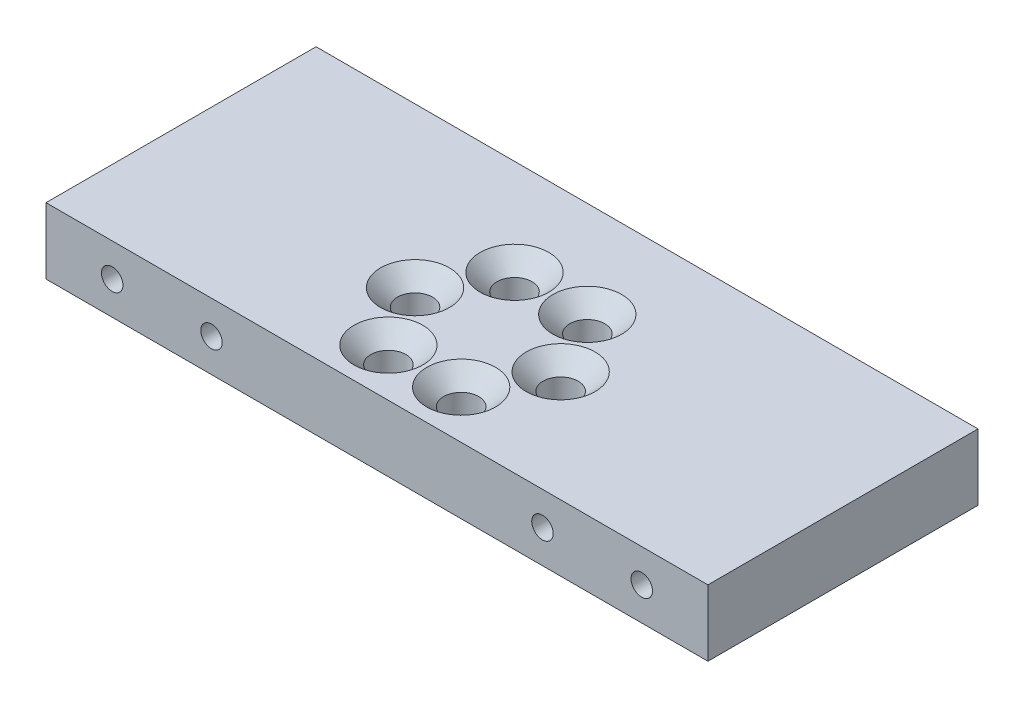
ISO-10303-21;
HEADER;
FILE_DESCRIPTION(('STEP AP214'),'2;1');
FILE_NAME('part.step','',(''),(''),'','','');
FILE_SCHEMA(('AUTOMOTIVE_DESIGN { 1 0 10303 214 1 1 1 1 }'));
ENDSEC;
DATA;
#1=APPLICATION_CONTEXT('core data for automotive mechanical design processes');
#2=APPLICATION_PROTOCOL_DEFINITION('international standard','automotive_design',2000,#1);
#3=PRODUCT_CONTEXT('',#1,'mechanical');
#4=PRODUCT('Part','Part','',(#3));
#5=PRODUCT_RELATED_PRODUCT_CATEGORY('part','',(#4));
#6=PRODUCT_DEFINITION_FORMATION('','',#4);
#7=PRODUCT_DEFINITION_CONTEXT('part definition',#1,'design');
#8=PRODUCT_DEFINITION('design','',#6,#7);
#9=PRODUCT_DEFINITION_SHAPE('','',#8);
#10=(LENGTH_UNIT() NAMED_UNIT(*) SI_UNIT(.MILLI.,.METRE.));
#11=(NAMED_UNIT(*) PLANE_ANGLE_UNIT() SI_UNIT($,.RADIAN.));
#12=(NAMED_UNIT(*) SI_UNIT($,.STERADIAN.) SOLID_ANGLE_UNIT());
#13=UNCERTAINTY_MEASURE_WITH_UNIT(LENGTH_MEASURE(1.E-05),#10,'distance_accuracy_value','');
#14=(GEOMETRIC_REPRESENTATION_CONTEXT(3) GLOBAL_UNCERTAINTY_ASSIGNED_CONTEXT((#13)) GLOBAL_UNIT_ASSIGNED_CONTEXT((#10,
#11,#12)) REPRESENTATION_CONTEXT('',''));
#15=CARTESIAN_POINT('',(0.,0.,0.));
#16=DIRECTION('',(0.,0.,1.));
#17=DIRECTION('',(1.,0.,0.));
#18=AXIS2_PLACEMENT_3D('',#15,#16,#17);
#19=CARTESIAN_POINT('',(50.,0.,-20.4));
#20=DIRECTION('',(0.,1.,0.));
#21=DIRECTION('',(1.,0.,0.));
#22=AXIS2_PLACEMENT_3D('',#19,#20,#21);
#23=PLANE('',#22);
#24=CARTESIAN_POINT('',(44.5,0.,-26.2762794416288));
#25=DIRECTION('',(0.,1.,0.));
#26=DIRECTION('',(1.,0.,0.));
#27=AXIS2_PLACEMENT_3D('',#24,#25,#26);
#28=CIRCLE('',#27,2.65);
#29=CARTESIAN_POINT('',(41.85,0.,-26.2762794416288));
#30=VERTEX_POINT('',#29);
#31=EDGE_CURVE('E250',#30,#30,#28,.T.);
#32=ORIENTED_EDGE('',*,*,#31,.T.);
#33=EDGE_LOOP('',(#32));
#34=FACE_BOUND('',#33,.T.);
#35=CARTESIAN_POINT('',(61.,0.,-16.75));
#36=DIRECTION('',(0.,1.,0.));
#37=DIRECTION('',(1.,0.,0.));
#38=AXIS2_PLACEMENT_3D('',#35,#36,#37);
#39=CIRCLE('',#38,2.65);
#40=CARTESIAN_POINT('',(58.35,0.,-16.75));
#41=VERTEX_POINT('',#40);
#42=EDGE_CURVE('E233',#41,#41,#39,.T.);
#43=ORIENTED_EDGE('',*,*,#42,.T.);
#44=EDGE_LOOP('',(#43));
#45=FACE_BOUND('',#44,.T.);
#46=CARTESIAN_POINT('',(44.5,0.,-7.22372055837118));
#47=DIRECTION('',(0.,1.,0.));
#48=DIRECTION('',(1.,0.,0.));
#49=AXIS2_PLACEMENT_3D('',#46,#47,#48);
#50=CIRCLE('',#49,2.65);
#51=CARTESIAN_POINT('',(41.85,0.,-7.22372055837118));
#52=VERTEX_POINT('',#51);
#53=EDGE_CURVE('E295',#52,#52,#50,.T.);
#54=ORIENTED_EDGE('',*,*,#53,.T.);
#55=EDGE_LOOP('',(#54));
#56=FACE_BOUND('',#55,.T.);
#57=CARTESIAN_POINT('',(39.,0.,-16.75));
#58=DIRECTION('',(0.,1.,0.));
#59=DIRECTION('',(1.,0.,0.));
#60=AXIS2_PLACEMENT_3D('',#57,#58,#59);
#61=CIRCLE('',#60,2.65);
#62=CARTESIAN_POINT('',(36.35,0.,-16.75));
#63=VERTEX_POINT('',#62);
#64=EDGE_CURVE('E220',#63,#63,#61,.T.);
#65=ORIENTED_EDGE('',*,*,#64,.T.);
#66=EDGE_LOOP('',(#65));
#67=FACE_BOUND('',#66,.T.);
#68=CARTESIAN_POINT('',(55.5,0.,-7.22372055837118));
#69=DIRECTION('',(0.,1.,0.));
#70=DIRECTION('',(1.,0.,0.));
#71=AXIS2_PLACEMENT_3D('',#68,#69,#70);
#72=CIRCLE('',#71,2.65);
#73=CARTESIAN_POINT('',(52.85,0.,-7.22372055837118));
#74=VERTEX_POINT('',#73);
#75=EDGE_CURVE('E300',#74,#74,#72,.T.);
#76=ORIENTED_EDGE('',*,*,#75,.T.);
#77=EDGE_LOOP('',(#76));
#78=FACE_BOUND('',#77,.T.);
#79=CARTESIAN_POINT('',(55.5,0.,-26.2762794416288));
#80=DIRECTION('',(0.,1.,0.));
#81=DIRECTION('',(1.,0.,0.));
#82=AXIS2_PLACEMENT_3D('',#79,#80,#81);
#83=CIRCLE('',#82,2.65);
#84=CARTESIAN_POINT('',(52.85,0.,-26.2762794416288));
#85=VERTEX_POINT('',#84);
#86=EDGE_CURVE('E302',#85,#85,#83,.T.);
#87=ORIENTED_EDGE('',*,*,#86,.T.);
#88=EDGE_LOOP('',(#87));
#89=FACE_BOUND('',#88,.T.);
#90=DIRECTION('',(0.,0.,-1.));
#91=VECTOR('',#90,1.);
#92=CARTESIAN_POINT('',(100.,0.,0.));
#93=LINE('',#92,#91);
#94=CARTESIAN_POINT('',(100.,0.,0.));
#95=VERTEX_POINT('',#94);
#96=CARTESIAN_POINT('',(100.,0.,-40.8));
#97=VERTEX_POINT('',#96);
#98=EDGE_CURVE('E26',#95,#97,#93,.T.);
#99=ORIENTED_EDGE('',*,*,#98,.F.);
#100=DIRECTION('',(1.,0.,0.));
#101=VECTOR('',#100,1.);
#102=CARTESIAN_POINT('',(0.,0.,0.));
#103=LINE('',#102,#101);
#104=CARTESIAN_POINT('',(0.,0.,0.));
#105=VERTEX_POINT('',#104);
#106=EDGE_CURVE('E192',#105,#95,#103,.T.);
#107=ORIENTED_EDGE('',*,*,#106,.F.);
#108=DIRECTION('',(0.,0.,1.));
#109=VECTOR('',#108,1.);
#110=CARTESIAN_POINT('',(0.,0.,-40.8));
#111=LINE('',#110,#109);
#112=CARTESIAN_POINT('',(0.,0.,-40.8));
#113=VERTEX_POINT('',#112);
#114=EDGE_CURVE('E185',#113,#105,#111,.T.);
#115=ORIENTED_EDGE('',*,*,#114,.F.);
#116=DIRECTION('',(-1.,0.,0.));
#117=VECTOR('',#116,1.);
#118=CARTESIAN_POINT('',(100.,0.,-40.8));
#119=LINE('',#118,#117);
#120=EDGE_CURVE('E171',#97,#113,#119,.T.);
#121=ORIENTED_EDGE('',*,*,#120,.F.);
#122=EDGE_LOOP('',(#99,#107,#115,#121));
#123=FACE_BOUND('',#122,.T.);
#124=ADVANCED_FACE('F17',(#34,#45,#56,#67,#78,#89,#123),#23,.F.);
#125=CARTESIAN_POINT('',(50.,10.,-20.4));
#126=DIRECTION('',(0.,1.,0.));
#127=DIRECTION('',(1.,0.,0.));
#128=AXIS2_PLACEMENT_3D('',#125,#126,#127);
#129=PLANE('',#128);
#130=CARTESIAN_POINT('',(44.5,10.,-26.2762794416288));
#131=DIRECTION('',(0.,-1.,0.));
#132=DIRECTION('',(1.,0.,0.));
#133=AXIS2_PLACEMENT_3D('',#130,#131,#132);
#134=CIRCLE('',#133,5.2);
#135=CARTESIAN_POINT('',(39.3,10.,-26.2762794416288));
#136=VERTEX_POINT('',#135);
#137=EDGE_CURVE('E237',#136,#136,#134,.T.);
#138=ORIENTED_EDGE('',*,*,#137,.T.);
#139=EDGE_LOOP('',(#138));
#140=FACE_BOUND('',#139,.T.);
#141=CARTESIAN_POINT('',(61.,10.,-16.75));
#142=DIRECTION('',(0.,-1.,0.));
#143=DIRECTION('',(1.,0.,0.));
#144=AXIS2_PLACEMENT_3D('',#141,#142,#143);
#145=CIRCLE('',#144,5.2);
#146=CARTESIAN_POINT('',(55.8,10.,-16.75));
#147=VERTEX_POINT('',#146);
#148=EDGE_CURVE('E343',#147,#147,#145,.T.);
#149=ORIENTED_EDGE('',*,*,#148,.T.);
#150=EDGE_LOOP('',(#149));
#151=FACE_BOUND('',#150,.T.);
#152=CARTESIAN_POINT('',(44.5,10.,-7.22372055837118));
#153=DIRECTION('',(0.,-1.,0.));
#154=DIRECTION('',(1.,0.,0.));
#155=AXIS2_PLACEMENT_3D('',#152,#153,#154);
#156=CIRCLE('',#155,5.2);
#157=CARTESIAN_POINT('',(39.3,10.,-7.22372055837118));
#158=VERTEX_POINT('',#157);
#159=EDGE_CURVE('E223',#158,#158,#156,.T.);
#160=ORIENTED_EDGE('',*,*,#159,.T.);
#161=EDGE_LOOP('',(#160));
#162=FACE_BOUND('',#161,.T.);
#163=CARTESIAN_POINT('',(39.,10.,-16.75));
#164=DIRECTION('',(0.,-1.,0.));
#165=DIRECTION('',(1.,0.,0.));
#166=AXIS2_PLACEMENT_3D('',#163,#164,#165);
#167=CIRCLE('',#166,5.2);
#168=CARTESIAN_POINT('',(33.8,10.,-16.75));
#169=VERTEX_POINT('',#168);
#170=EDGE_CURVE('E361',#169,#169,#167,.T.);
#171=ORIENTED_EDGE('',*,*,#170,.T.);
#172=EDGE_LOOP('',(#171));
#173=FACE_BOUND('',#172,.T.);
#174=CARTESIAN_POINT('',(55.5,10.,-7.22372055837118));
#175=DIRECTION('',(0.,-1.,0.));
#176=DIRECTION('',(1.,0.,0.));
#177=AXIS2_PLACEMENT_3D('',#174,#175,#176);
#178=CIRCLE('',#177,5.2);
#179=CARTESIAN_POINT('',(50.3,10.,-7.22372055837118));
#180=VERTEX_POINT('',#179);
#181=EDGE_CURVE('E307',#180,#180,#178,.T.);
#182=ORIENTED_EDGE('',*,*,#181,.T.);
#183=EDGE_LOOP('',(#182));
#184=FACE_BOUND('',#183,.T.);
#185=CARTESIAN_POINT('',(55.5,10.,-26.2762794416288));
#186=DIRECTION('',(0.,-1.,0.));
#187=DIRECTION('',(1.,0.,0.));
#188=AXIS2_PLACEMENT_3D('',#185,#186,#187);
#189=CIRCLE('',#188,5.2);
#190=CARTESIAN_POINT('',(50.3,10.,-26.2762794416288));
#191=VERTEX_POINT('',#190);
#192=EDGE_CURVE('E326',#191,#191,#189,.T.);
#193=ORIENTED_EDGE('',*,*,#192,.T.);
#194=EDGE_LOOP('',(#193));
#195=FACE_BOUND('',#194,.T.);
#196=DIRECTION('',(0.,0.,-1.));
#197=VECTOR('',#196,1.);
#198=CARTESIAN_POINT('',(100.,10.,0.));
#199=LINE('',#198,#197);
#200=CARTESIAN_POINT('',(100.,10.,0.));
#201=VERTEX_POINT('',#200);
#202=CARTESIAN_POINT('',(100.,10.,-40.8));
#203=VERTEX_POINT('',#202);
#204=EDGE_CURVE('E11',#201,#203,#199,.T.);
#205=ORIENTED_EDGE('',*,*,#204,.T.);
#206=DIRECTION('',(-1.,0.,0.));
#207=VECTOR('',#206,1.);
#208=CARTESIAN_POINT('',(100.,10.,-40.8));
#209=LINE('',#208,#207);
#210=CARTESIAN_POINT('',(0.,10.,-40.8));
#211=VERTEX_POINT('',#210);
#212=EDGE_CURVE('E180',#203,#211,#209,.T.);
#213=ORIENTED_EDGE('',*,*,#212,.T.);
#214=DIRECTION('',(0.,0.,1.));
#215=VECTOR('',#214,1.);
#216=CARTESIAN_POINT('',(0.,10.,-40.8));
#217=LINE('',#216,#215);
#218=CARTESIAN_POINT('',(0.,10.,0.));
#219=VERTEX_POINT('',#218);
#220=EDGE_CURVE('E187',#211,#219,#217,.T.);
#221=ORIENTED_EDGE('',*,*,#220,.T.);
#222=DIRECTION('',(1.,0.,0.));
#223=VECTOR('',#222,1.);
#224=CARTESIAN_POINT('',(0.,10.,0.));
#225=LINE('',#224,#223);
#226=EDGE_CURVE('E202',#219,#201,#225,.T.);
#227=ORIENTED_EDGE('',*,*,#226,.T.);
#228=EDGE_LOOP('',(#205,#213,#221,#227));
#229=FACE_BOUND('',#228,.T.);
#230=ADVANCED_FACE('F262',(#140,#151,#162,#173,#184,#195,#229),#129,.T.);
#231=CARTESIAN_POINT('',(100.,0.,0.));
#232=DIRECTION('',(1.,0.,0.));
#233=DIRECTION('',(0.,0.,-1.));
#234=AXIS2_PLACEMENT_3D('',#231,#232,#233);
#235=PLANE('',#234);
#236=ORIENTED_EDGE('',*,*,#98,.T.);
#237=DIRECTION('',(0.,1.,0.));
#238=VECTOR('',#237,1.);
#239=CARTESIAN_POINT('',(100.,0.,-40.8));
#240=LINE('',#239,#238);
#241=EDGE_CURVE('E20',#97,#203,#240,.T.);
#242=ORIENTED_EDGE('',*,*,#241,.T.);
#243=ORIENTED_EDGE('',*,*,#204,.F.);
#244=DIRECTION('',(0.,1.,0.));
#245=VECTOR('',#244,1.);
#246=CARTESIAN_POINT('',(100.,0.,0.));
#247=LINE('',#246,#245);
#248=EDGE_CURVE('E252',#95,#201,#247,.T.);
#249=ORIENTED_EDGE('',*,*,#248,.F.);
#250=EDGE_LOOP('',(#236,#242,#243,#249));
#251=FACE_BOUND('',#250,.T.);
#252=ADVANCED_FACE('F287',(#251),#235,.T.);
#253=CARTESIAN_POINT('',(100.,0.,-40.8));
#254=DIRECTION('',(0.,0.,-1.));
#255=DIRECTION('',(-1.,0.,0.));
#256=AXIS2_PLACEMENT_3D('',#253,#254,#255);
#257=PLANE('',#256);
#258=CARTESIAN_POINT('',(10.,5.,-40.8));
#259=DIRECTION('',(0.,0.,1.));
#260=DIRECTION('',(1.,0.,0.));
#261=AXIS2_PLACEMENT_3D('',#258,#259,#260);
#262=CIRCLE('',#261,1.621);
#263=CARTESIAN_POINT('',(8.379,5.,-40.8));
#264=VERTEX_POINT('',#263);
#265=EDGE_CURVE('E550',#264,#264,#262,.T.);
#266=ORIENTED_EDGE('',*,*,#265,.T.);
#267=EDGE_LOOP('',(#266));
#268=FACE_BOUND('',#267,.T.);
#269=CARTESIAN_POINT('',(25.,5.,-40.8));
#270=DIRECTION('',(0.,0.,1.));
#271=DIRECTION('',(1.,0.,0.));
#272=AXIS2_PLACEMENT_3D('',#269,#270,#271);
#273=CIRCLE('',#272,1.621);
#274=CARTESIAN_POINT('',(23.379,5.,-40.8));
#275=VERTEX_POINT('',#274);
#276=EDGE_CURVE('E513',#275,#275,#273,.T.);
#277=ORIENTED_EDGE('',*,*,#276,.T.);
#278=EDGE_LOOP('',(#277));
#279=FACE_BOUND('',#278,.T.);
#280=CARTESIAN_POINT('',(75.,5.,-40.8));
#281=DIRECTION('',(0.,0.,1.));
#282=DIRECTION('',(1.,0.,0.));
#283=AXIS2_PLACEMENT_3D('',#280,#281,#282);
#284=CIRCLE('',#283,1.621);
#285=CARTESIAN_POINT('',(73.379,5.,-40.8));
#286=VERTEX_POINT('',#285);
#287=EDGE_CURVE('E538',#286,#286,#284,.T.);
#288=ORIENTED_EDGE('',*,*,#287,.T.);
#289=EDGE_LOOP('',(#288));
#290=FACE_BOUND('',#289,.T.);
#291=CARTESIAN_POINT('',(90.,5.,-40.8));
#292=DIRECTION('',(0.,0.,1.));
#293=DIRECTION('',(1.,0.,0.));
#294=AXIS2_PLACEMENT_3D('',#291,#292,#293);
#295=CIRCLE('',#294,1.621);
#296=CARTESIAN_POINT('',(88.379,5.,-40.8));
#297=VERTEX_POINT('',#296);
#298=EDGE_CURVE('E524',#297,#297,#295,.T.);
#299=ORIENTED_EDGE('',*,*,#298,.T.);
#300=EDGE_LOOP('',(#299));
#301=FACE_BOUND('',#300,.T.);
#302=ORIENTED_EDGE('',*,*,#120,.T.);
#303=DIRECTION('',(0.,1.,0.));
#304=VECTOR('',#303,1.);
#305=CARTESIAN_POINT('',(0.,0.,-40.8));
#306=LINE('',#305,#304);
#307=EDGE_CURVE('E175',#113,#211,#306,.T.);
#308=ORIENTED_EDGE('',*,*,#307,.T.);
#309=ORIENTED_EDGE('',*,*,#212,.F.);
#310=ORIENTED_EDGE('',*,*,#241,.F.);
#311=EDGE_LOOP('',(#302,#308,#309,#310));
#312=FACE_BOUND('',#311,.T.);
#313=ADVANCED_FACE('F173',(#268,#279,#290,#301,#312),#257,.T.);
#314=CARTESIAN_POINT('',(0.,0.,-40.8));
#315=DIRECTION('',(-1.,0.,0.));
#316=DIRECTION('',(0.,1.,0.));
#317=AXIS2_PLACEMENT_3D('',#314,#315,#316);
#318=PLANE('',#317);
#319=ORIENTED_EDGE('',*,*,#114,.T.);
#320=DIRECTION('',(0.,1.,0.));
#321=VECTOR('',#320,1.);
#322=CARTESIAN_POINT('',(0.,0.,0.));
#323=LINE('',#322,#321);
#324=EDGE_CURVE('E194',#105,#219,#323,.T.);
#325=ORIENTED_EDGE('',*,*,#324,.T.);
#326=ORIENTED_EDGE('',*,*,#220,.F.);
#327=ORIENTED_EDGE('',*,*,#307,.F.);
#328=EDGE_LOOP('',(#319,#325,#326,#327));
#329=FACE_BOUND('',#328,.T.);
#330=ADVANCED_FACE('F183',(#329),#318,.T.);
#331=CARTESIAN_POINT('',(0.,0.,0.));
#332=DIRECTION('',(0.,0.,1.));
#333=DIRECTION('',(1.,0.,0.));
#334=AXIS2_PLACEMENT_3D('',#331,#332,#333);
#335=PLANE('',#334);
#336=CARTESIAN_POINT('',(10.,5.,0.));
#337=DIRECTION('',(0.,0.,-1.));
#338=DIRECTION('',(1.,0.,0.));
#339=AXIS2_PLACEMENT_3D('',#336,#337,#338);
#340=CIRCLE('',#339,1.621);
#341=CARTESIAN_POINT('',(8.379,5.,0.));
#342=VERTEX_POINT('',#341);
#343=EDGE_CURVE('E464',#342,#342,#340,.T.);
#344=ORIENTED_EDGE('',*,*,#343,.T.);
#345=EDGE_LOOP('',(#344));
#346=FACE_BOUND('',#345,.T.);
#347=CARTESIAN_POINT('',(25.,5.,0.));
#348=DIRECTION('',(0.,0.,-1.));
#349=DIRECTION('',(1.,0.,0.));
#350=AXIS2_PLACEMENT_3D('',#347,#348,#349);
#351=CIRCLE('',#350,1.621);
#352=CARTESIAN_POINT('',(23.379,5.,0.));
#353=VERTEX_POINT('',#352);
#354=EDGE_CURVE('E452',#353,#353,#351,.T.);
#355=ORIENTED_EDGE('',*,*,#354,.T.);
#356=EDGE_LOOP('',(#355));
#357=FACE_BOUND('',#356,.T.);
#358=CARTESIAN_POINT('',(75.,5.,0.));
#359=DIRECTION('',(0.,0.,-1.));
#360=DIRECTION('',(1.,0.,0.));
#361=AXIS2_PLACEMENT_3D('',#358,#359,#360);
#362=CIRCLE('',#361,1.621);
#363=CARTESIAN_POINT('',(73.379,5.,0.));
#364=VERTEX_POINT('',#363);
#365=EDGE_CURVE('E440',#364,#364,#362,.T.);
#366=ORIENTED_EDGE('',*,*,#365,.T.);
#367=EDGE_LOOP('',(#366));
#368=FACE_BOUND('',#367,.T.);
#369=CARTESIAN_POINT('',(90.,5.,0.));
#370=DIRECTION('',(0.,0.,-1.));
#371=DIRECTION('',(1.,0.,0.));
#372=AXIS2_PLACEMENT_3D('',#369,#370,#371);
#373=CIRCLE('',#372,1.621);
#374=CARTESIAN_POINT('',(88.379,5.,0.));
#375=VERTEX_POINT('',#374);
#376=EDGE_CURVE('E515',#375,#375,#373,.T.);
#377=ORIENTED_EDGE('',*,*,#376,.T.);
#378=EDGE_LOOP('',(#377));
#379=FACE_BOUND('',#378,.T.);
#380=ORIENTED_EDGE('',*,*,#106,.T.);
#381=ORIENTED_EDGE('',*,*,#248,.T.);
#382=ORIENTED_EDGE('',*,*,#226,.F.);
#383=ORIENTED_EDGE('',*,*,#324,.F.);
#384=EDGE_LOOP('',(#380,#381,#382,#383));
#385=FACE_BOUND('',#384,.T.);
#386=ADVANCED_FACE('F263',(#346,#357,#368,#379,#385),#335,.T.);
#387=CARTESIAN_POINT('',(44.5,-98.464925206262,-26.2762794416288));
#388=DIRECTION('',(0.,1.,0.));
#389=DIRECTION('',(1.,0.,0.));
#390=AXIS2_PLACEMENT_3D('',#387,#388,#389);
#391=CYLINDRICAL_SURFACE('',#390,2.65);
#392=CARTESIAN_POINT('',(44.5,7.45,-26.2762794416288));
#393=DIRECTION('',(0.,1.,0.));
#394=DIRECTION('',(1.,0.,0.));
#395=AXIS2_PLACEMENT_3D('',#392,#393,#394);
#396=CIRCLE('',#395,2.65);
#397=CARTESIAN_POINT('',(41.85,7.45,-26.2762794416288));
#398=VERTEX_POINT('',#397);
#399=EDGE_CURVE('E242',#398,#398,#396,.T.);
#400=ORIENTED_EDGE('',*,*,#399,.T.);
#401=DIRECTION('',(0.,-1.,0.));
#402=VECTOR('',#401,1.);
#403=CARTESIAN_POINT('',(41.85,-98.464925206262,-26.2762794416288));
#404=LINE('',#403,#402);
#405=EDGE_CURVE('E246',#398,#30,#404,.T.);
#406=ORIENTED_EDGE('',*,*,#405,.T.);
#407=ORIENTED_EDGE('',*,*,#31,.F.);
#408=ORIENTED_EDGE('',*,*,#405,.F.);
#409=EDGE_LOOP('',(#400,#406,#407,#408));
#410=FACE_BOUND('',#409,.T.);
#411=ADVANCED_FACE('F265',(#410),#391,.F.);
#412=CARTESIAN_POINT('',(44.5,8.725,-26.2762794416288));
#413=DIRECTION('',(0.,1.,0.));
#414=DIRECTION('',(1.,0.,0.));
#415=AXIS2_PLACEMENT_3D('',#412,#413,#414);
#416=CONICAL_SURFACE('',#415,3.925,0.785398163397448);
#417=ORIENTED_EDGE('',*,*,#137,.F.);
#418=DIRECTION('',(0.707106781186547,-0.707106781186548,0.));
#419=VECTOR('',#418,1.);
#420=CARTESIAN_POINT('',(40.575,8.725,-26.2762794416288));
#421=LINE('',#420,#419);
#422=EDGE_CURVE('E241',#136,#398,#421,.T.);
#423=ORIENTED_EDGE('',*,*,#422,.T.);
#424=ORIENTED_EDGE('',*,*,#399,.F.);
#425=ORIENTED_EDGE('',*,*,#422,.F.);
#426=EDGE_LOOP('',(#417,#423,#424,#425));
#427=FACE_BOUND('',#426,.T.);
#428=ADVANCED_FACE('F274',(#427),#416,.F.);
#429=CARTESIAN_POINT('',(61.,-98.464925206262,-16.75));
#430=DIRECTION('',(0.,1.,0.));
#431=DIRECTION('',(1.,0.,0.));
#432=AXIS2_PLACEMENT_3D('',#429,#430,#431);
#433=CYLINDRICAL_SURFACE('',#432,2.65);
#434=CARTESIAN_POINT('',(61.,7.45,-16.75));
#435=DIRECTION('',(0.,1.,0.));
#436=DIRECTION('',(1.,0.,0.));
#437=AXIS2_PLACEMENT_3D('',#434,#435,#436);
#438=CIRCLE('',#437,2.65);
#439=CARTESIAN_POINT('',(58.35,7.45,-16.75));
#440=VERTEX_POINT('',#439);
#441=EDGE_CURVE('E234',#440,#440,#438,.T.);
#442=ORIENTED_EDGE('',*,*,#441,.T.);
#443=DIRECTION('',(0.,-1.,0.));
#444=VECTOR('',#443,1.);
#445=CARTESIAN_POINT('',(58.35,-98.464925206262,-16.75));
#446=LINE('',#445,#444);
#447=EDGE_CURVE('E229',#440,#41,#446,.T.);
#448=ORIENTED_EDGE('',*,*,#447,.T.);
#449=ORIENTED_EDGE('',*,*,#42,.F.);
#450=ORIENTED_EDGE('',*,*,#447,.F.);
#451=EDGE_LOOP('',(#442,#448,#449,#450));
#452=FACE_BOUND('',#451,.T.);
#453=ADVANCED_FACE('F422',(#452),#433,.F.);
#454=CARTESIAN_POINT('',(61.,8.725,-16.75));
#455=DIRECTION('',(0.,1.,0.));
#456=DIRECTION('',(1.,0.,0.));
#457=AXIS2_PLACEMENT_3D('',#454,#455,#456);
#458=CONICAL_SURFACE('',#457,3.925,0.785398163397448);
#459=ORIENTED_EDGE('',*,*,#148,.F.);
#460=DIRECTION('',(0.707106781186547,-0.707106781186548,0.));
#461=VECTOR('',#460,1.);
#462=CARTESIAN_POINT('',(57.075,8.725,-16.75));
#463=LINE('',#462,#461);
#464=EDGE_CURVE('E340',#147,#440,#463,.T.);
#465=ORIENTED_EDGE('',*,*,#464,.T.);
#466=ORIENTED_EDGE('',*,*,#441,.F.);
#467=ORIENTED_EDGE('',*,*,#464,.F.);
#468=EDGE_LOOP('',(#459,#465,#466,#467));
#469=FACE_BOUND('',#468,.T.);
#470=ADVANCED_FACE('F419',(#469),#458,.F.);
#471=CARTESIAN_POINT('',(44.5,-98.464925206262,-7.22372055837118));
#472=DIRECTION('',(0.,1.,0.));
#473=DIRECTION('',(1.,0.,0.));
#474=AXIS2_PLACEMENT_3D('',#471,#472,#473);
#475=CYLINDRICAL_SURFACE('',#474,2.65);
#476=CARTESIAN_POINT('',(44.5,7.45,-7.22372055837118));
#477=DIRECTION('',(0.,1.,0.));
#478=DIRECTION('',(1.,0.,0.));
#479=AXIS2_PLACEMENT_3D('',#476,#477,#478);
#480=CIRCLE('',#479,2.65);
#481=CARTESIAN_POINT('',(41.85,7.45,-7.22372055837118));
#482=VERTEX_POINT('',#481);
#483=EDGE_CURVE('E450',#482,#482,#480,.T.);
#484=ORIENTED_EDGE('',*,*,#483,.T.);
#485=DIRECTION('',(0.,-1.,0.));
#486=VECTOR('',#485,1.);
#487=CARTESIAN_POINT('',(41.85,-98.464925206262,-7.22372055837118));
#488=LINE('',#487,#486);
#489=EDGE_CURVE('E355',#482,#52,#488,.T.);
#490=ORIENTED_EDGE('',*,*,#489,.T.);
#491=ORIENTED_EDGE('',*,*,#53,.F.);
#492=ORIENTED_EDGE('',*,*,#489,.F.);
#493=EDGE_LOOP('',(#484,#490,#491,#492));
#494=FACE_BOUND('',#493,.T.);
#495=ADVANCED_FACE('F415',(#494),#475,.F.);
#496=CARTESIAN_POINT('',(44.5,8.725,-7.22372055837118));
#497=DIRECTION('',(0.,1.,0.));
#498=DIRECTION('',(1.,0.,0.));
#499=AXIS2_PLACEMENT_3D('',#496,#497,#498);
#500=CONICAL_SURFACE('',#499,3.925,0.785398163397448);
#501=ORIENTED_EDGE('',*,*,#159,.F.);
#502=DIRECTION('',(0.707106781186547,-0.707106781186548,0.));
#503=VECTOR('',#502,1.);
#504=CARTESIAN_POINT('',(40.575,8.725,-7.22372055837118));
#505=LINE('',#504,#503);
#506=EDGE_CURVE('E228',#158,#482,#505,.T.);
#507=ORIENTED_EDGE('',*,*,#506,.T.);
#508=ORIENTED_EDGE('',*,*,#483,.F.);
#509=ORIENTED_EDGE('',*,*,#506,.F.);
#510=EDGE_LOOP('',(#501,#507,#508,#509));
#511=FACE_BOUND('',#510,.T.);
#512=ADVANCED_FACE('F411',(#511),#500,.F.);
#513=CARTESIAN_POINT('',(39.,-98.464925206262,-16.75));
#514=DIRECTION('',(0.,1.,0.));
#515=DIRECTION('',(1.,0.,0.));
#516=AXIS2_PLACEMENT_3D('',#513,#514,#515);
#517=CYLINDRICAL_SURFACE('',#516,2.65);
#518=CARTESIAN_POINT('',(39.,7.45,-16.75));
#519=DIRECTION('',(0.,1.,0.));
#520=DIRECTION('',(1.,0.,0.));
#521=AXIS2_PLACEMENT_3D('',#518,#519,#520);
#522=CIRCLE('',#521,2.65);
#523=CARTESIAN_POINT('',(36.35,7.45,-16.75));
#524=VERTEX_POINT('',#523);
#525=EDGE_CURVE('E218',#524,#524,#522,.T.);
#526=ORIENTED_EDGE('',*,*,#525,.T.);
#527=DIRECTION('',(0.,-1.,0.));
#528=VECTOR('',#527,1.);
#529=CARTESIAN_POINT('',(36.35,-98.464925206262,-16.75));
#530=LINE('',#529,#528);
#531=EDGE_CURVE('E224',#524,#63,#530,.T.);
#532=ORIENTED_EDGE('',*,*,#531,.T.);
#533=ORIENTED_EDGE('',*,*,#64,.F.);
#534=ORIENTED_EDGE('',*,*,#531,.F.);
#535=EDGE_LOOP('',(#526,#532,#533,#534));
#536=FACE_BOUND('',#535,.T.);
#537=ADVANCED_FACE('F377',(#536),#517,.F.);
#538=CARTESIAN_POINT('',(39.,8.725,-16.75));
#539=DIRECTION('',(0.,1.,0.));
#540=DIRECTION('',(1.,0.,0.));
#541=AXIS2_PLACEMENT_3D('',#538,#539,#540);
#542=CONICAL_SURFACE('',#541,3.925,0.785398163397448);
#543=ORIENTED_EDGE('',*,*,#170,.F.);
#544=DIRECTION('',(0.707106781186547,-0.707106781186548,0.));
#545=VECTOR('',#544,1.);
#546=CARTESIAN_POINT('',(35.075,8.725,-16.75));
#547=LINE('',#546,#545);
#548=EDGE_CURVE('E364',#169,#524,#547,.T.);
#549=ORIENTED_EDGE('',*,*,#548,.T.);
#550=ORIENTED_EDGE('',*,*,#525,.F.);
#551=ORIENTED_EDGE('',*,*,#548,.F.);
#552=EDGE_LOOP('',(#543,#549,#550,#551));
#553=FACE_BOUND('',#552,.T.);
#554=ADVANCED_FACE('F378',(#553),#542,.F.);
#555=CARTESIAN_POINT('',(55.5,-98.464925206262,-7.22372055837118));
#556=DIRECTION('',(0.,1.,0.));
#557=DIRECTION('',(1.,0.,0.));
#558=AXIS2_PLACEMENT_3D('',#555,#556,#557);
#559=CYLINDRICAL_SURFACE('',#558,2.65);
#560=CARTESIAN_POINT('',(55.5,7.45,-7.22372055837118));
#561=DIRECTION('',(0.,1.,0.));
#562=DIRECTION('',(1.,0.,0.));
#563=AXIS2_PLACEMENT_3D('',#560,#561,#562);
#564=CIRCLE('',#563,2.65);
#565=CARTESIAN_POINT('',(52.85,7.45,-7.22372055837118));
#566=VERTEX_POINT('',#565);
#567=EDGE_CURVE('E348',#566,#566,#564,.T.);
#568=ORIENTED_EDGE('',*,*,#567,.T.);
#569=DIRECTION('',(0.,-1.,0.));
#570=VECTOR('',#569,1.);
#571=CARTESIAN_POINT('',(52.85,-98.464925206262,-7.22372055837118));
#572=LINE('',#571,#570);
#573=EDGE_CURVE('E352',#566,#74,#572,.T.);
#574=ORIENTED_EDGE('',*,*,#573,.T.);
#575=ORIENTED_EDGE('',*,*,#75,.F.);
#576=ORIENTED_EDGE('',*,*,#573,.F.);
#577=EDGE_LOOP('',(#568,#574,#575,#576));
#578=FACE_BOUND('',#577,.T.);
#579=ADVANCED_FACE('F400',(#578),#559,.F.);
#580=CARTESIAN_POINT('',(55.5,8.725,-7.22372055837118));
#581=DIRECTION('',(0.,1.,0.));
#582=DIRECTION('',(1.,0.,0.));
#583=AXIS2_PLACEMENT_3D('',#580,#581,#582);
#584=CONICAL_SURFACE('',#583,3.925,0.785398163397448);
#585=ORIENTED_EDGE('',*,*,#181,.F.);
#586=DIRECTION('',(0.707106781186547,-0.707106781186548,0.));
#587=VECTOR('',#586,1.);
#588=CARTESIAN_POINT('',(51.575,8.725,-7.22372055837118));
#589=LINE('',#588,#587);
#590=EDGE_CURVE('E315',#180,#566,#589,.T.);
#591=ORIENTED_EDGE('',*,*,#590,.T.);
#592=ORIENTED_EDGE('',*,*,#567,.F.);
#593=ORIENTED_EDGE('',*,*,#590,.F.);
#594=EDGE_LOOP('',(#585,#591,#592,#593));
#595=FACE_BOUND('',#594,.T.);
#596=ADVANCED_FACE('F391',(#595),#584,.F.);
#597=CARTESIAN_POINT('',(55.5,-98.464925206262,-26.2762794416288));
#598=DIRECTION('',(0.,1.,0.));
#599=DIRECTION('',(1.,0.,0.));
#600=AXIS2_PLACEMENT_3D('',#597,#598,#599);
#601=CYLINDRICAL_SURFACE('',#600,2.65);
#602=CARTESIAN_POINT('',(55.5,7.45,-26.2762794416288));
#603=DIRECTION('',(0.,1.,0.));
#604=DIRECTION('',(1.,0.,0.));
#605=AXIS2_PLACEMENT_3D('',#602,#603,#604);
#606=CIRCLE('',#605,2.65);
#607=CARTESIAN_POINT('',(52.85,7.45,-26.2762794416288));
#608=VERTEX_POINT('',#607);
#609=EDGE_CURVE('E317',#608,#608,#606,.T.);
#610=ORIENTED_EDGE('',*,*,#609,.T.);
#611=DIRECTION('',(0.,-1.,0.));
#612=VECTOR('',#611,1.);
#613=CARTESIAN_POINT('',(52.85,-98.464925206262,-26.2762794416288));
#614=LINE('',#613,#612);
#615=EDGE_CURVE('E308',#608,#85,#614,.T.);
#616=ORIENTED_EDGE('',*,*,#615,.T.);
#617=ORIENTED_EDGE('',*,*,#86,.F.);
#618=ORIENTED_EDGE('',*,*,#615,.F.);
#619=EDGE_LOOP('',(#610,#616,#617,#618));
#620=FACE_BOUND('',#619,.T.);
#621=ADVANCED_FACE('F389',(#620),#601,.F.);
#622=CARTESIAN_POINT('',(55.5,8.725,-26.2762794416288));
#623=DIRECTION('',(0.,1.,0.));
#624=DIRECTION('',(1.,0.,0.));
#625=AXIS2_PLACEMENT_3D('',#622,#623,#624);
#626=CONICAL_SURFACE('',#625,3.925,0.785398163397448);
#627=ORIENTED_EDGE('',*,*,#192,.F.);
#628=DIRECTION('',(0.707106781186547,-0.707106781186548,0.));
#629=VECTOR('',#628,1.);
#630=CARTESIAN_POINT('',(51.575,8.725,-26.2762794416288));
#631=LINE('',#630,#629);
#632=EDGE_CURVE('E330',#191,#608,#631,.T.);
#633=ORIENTED_EDGE('',*,*,#632,.T.);
#634=ORIENTED_EDGE('',*,*,#609,.F.);
#635=ORIENTED_EDGE('',*,*,#632,.F.);
#636=EDGE_LOOP('',(#627,#633,#634,#635));
#637=FACE_BOUND('',#636,.T.);
#638=ADVANCED_FACE('F385',(#637),#626,.F.);
#639=CARTESIAN_POINT('',(10.,5.,-11.8));
#640=DIRECTION('',(0.,0.,1.));
#641=DIRECTION('',(1.,0.,0.));
#642=AXIS2_PLACEMENT_3D('',#639,#640,#641);
#643=PLANE('',#642);
#644=CARTESIAN_POINT('',(10.,5.,-11.8));
#645=DIRECTION('',(0.,0.,1.));
#646=DIRECTION('',(1.,0.,0.));
#647=AXIS2_PLACEMENT_3D('',#644,#645,#646);
#648=CIRCLE('',#647,1.621);
#649=CARTESIAN_POINT('',(8.379,5.,-11.8));
#650=VERTEX_POINT('',#649);
#651=EDGE_CURVE('E322',#650,#650,#648,.T.);
#652=ORIENTED_EDGE('',*,*,#651,.T.);
#653=EDGE_LOOP('',(#652));
#654=FACE_BOUND('',#653,.T.);
#655=ADVANCED_FACE('F398',(#654),#643,.T.);
#656=CARTESIAN_POINT('',(10.,5.,-5.9));
#657=DIRECTION('',(0.,0.,1.));
#658=DIRECTION('',(1.,0.,0.));
#659=AXIS2_PLACEMENT_3D('',#656,#657,#658);
#660=CYLINDRICAL_SURFACE('',#659,1.621);
#661=ORIENTED_EDGE('',*,*,#343,.F.);
#662=DIRECTION('',(0.,0.,-1.));
#663=VECTOR('',#662,1.);
#664=CARTESIAN_POINT('',(8.379,5.,-5.9));
#665=LINE('',#664,#663);
#666=EDGE_CURVE('E321',#342,#650,#665,.T.);
#667=ORIENTED_EDGE('',*,*,#666,.T.);
#668=ORIENTED_EDGE('',*,*,#651,.F.);
#669=ORIENTED_EDGE('',*,*,#666,.F.);
#670=EDGE_LOOP('',(#661,#667,#668,#669));
#671=FACE_BOUND('',#670,.T.);
#672=ADVANCED_FACE('F475',(#671),#660,.F.);
#673=CARTESIAN_POINT('',(25.,5.,-11.8));
#674=DIRECTION('',(0.,0.,1.));
#675=DIRECTION('',(1.,0.,0.));
#676=AXIS2_PLACEMENT_3D('',#673,#674,#675);
#677=PLANE('',#676);
#678=CARTESIAN_POINT('',(25.,5.,-11.8));
#679=DIRECTION('',(0.,0.,1.));
#680=DIRECTION('',(1.,0.,0.));
#681=AXIS2_PLACEMENT_3D('',#678,#679,#680);
#682=CIRCLE('',#681,1.621);
#683=CARTESIAN_POINT('',(23.379,5.,-11.8));
#684=VERTEX_POINT('',#683);
#685=EDGE_CURVE('E461',#684,#684,#682,.T.);
#686=ORIENTED_EDGE('',*,*,#685,.T.);
#687=EDGE_LOOP('',(#686));
#688=FACE_BOUND('',#687,.T.);
#689=ADVANCED_FACE('F640',(#688),#677,.T.);
#690=CARTESIAN_POINT('',(25.,5.,-5.9));
#691=DIRECTION('',(0.,0.,1.));
#692=DIRECTION('',(1.,0.,0.));
#693=AXIS2_PLACEMENT_3D('',#690,#691,#692);
#694=CYLINDRICAL_SURFACE('',#693,1.621);
#695=ORIENTED_EDGE('',*,*,#354,.F.);
#696=DIRECTION('',(0.,0.,-1.));
#697=VECTOR('',#696,1.);
#698=CARTESIAN_POINT('',(23.379,5.,-5.9));
#699=LINE('',#698,#697);
#700=EDGE_CURVE('E457',#353,#684,#699,.T.);
#701=ORIENTED_EDGE('',*,*,#700,.T.);
#702=ORIENTED_EDGE('',*,*,#685,.F.);
#703=ORIENTED_EDGE('',*,*,#700,.F.);
#704=EDGE_LOOP('',(#695,#701,#702,#703));
#705=FACE_BOUND('',#704,.T.);
#706=ADVANCED_FACE('F643',(#705),#694,.F.);
#707=CARTESIAN_POINT('',(75.,5.,-11.8));
#708=DIRECTION('',(0.,0.,1.));
#709=DIRECTION('',(1.,0.,0.));
#710=AXIS2_PLACEMENT_3D('',#707,#708,#709);
#711=PLANE('',#710);
#712=CARTESIAN_POINT('',(75.,5.,-11.8));
#713=DIRECTION('',(0.,0.,1.));
#714=DIRECTION('',(1.,0.,0.));
#715=AXIS2_PLACEMENT_3D('',#712,#713,#714);
#716=CIRCLE('',#715,1.621);
#717=CARTESIAN_POINT('',(73.379,5.,-11.8));
#718=VERTEX_POINT('',#717);
#719=EDGE_CURVE('E446',#718,#718,#716,.T.);
#720=ORIENTED_EDGE('',*,*,#719,.T.);
#721=EDGE_LOOP('',(#720));
#722=FACE_BOUND('',#721,.T.);
#723=ADVANCED_FACE('F653',(#722),#711,.T.);
#724=CARTESIAN_POINT('',(75.,5.,-5.9));
#725=DIRECTION('',(0.,0.,1.));
#726=DIRECTION('',(1.,0.,0.));
#727=AXIS2_PLACEMENT_3D('',#724,#725,#726);
#728=CYLINDRICAL_SURFACE('',#727,1.621);
#729=ORIENTED_EDGE('',*,*,#365,.F.);
#730=DIRECTION('',(0.,0.,-1.));
#731=VECTOR('',#730,1.);
#732=CARTESIAN_POINT('',(73.379,5.,-5.9));
#733=LINE('',#732,#731);
#734=EDGE_CURVE('E442',#364,#718,#733,.T.);
#735=ORIENTED_EDGE('',*,*,#734,.T.);
#736=ORIENTED_EDGE('',*,*,#719,.F.);
#737=ORIENTED_EDGE('',*,*,#734,.F.);
#738=EDGE_LOOP('',(#729,#735,#736,#737));
#739=FACE_BOUND('',#738,.T.);
#740=ADVANCED_FACE('F650',(#739),#728,.F.);
#741=CARTESIAN_POINT('',(90.,5.,-11.8));
#742=DIRECTION('',(0.,0.,1.));
#743=DIRECTION('',(1.,0.,0.));
#744=AXIS2_PLACEMENT_3D('',#741,#742,#743);
#745=PLANE('',#744);
#746=CARTESIAN_POINT('',(90.,5.,-11.8));
#747=DIRECTION('',(0.,0.,1.));
#748=DIRECTION('',(1.,0.,0.));
#749=AXIS2_PLACEMENT_3D('',#746,#747,#748);
#750=CIRCLE('',#749,1.621);
#751=CARTESIAN_POINT('',(88.379,5.,-11.8));
#752=VERTEX_POINT('',#751);
#753=EDGE_CURVE('E539',#752,#752,#750,.T.);
#754=ORIENTED_EDGE('',*,*,#753,.T.);
#755=EDGE_LOOP('',(#754));
#756=FACE_BOUND('',#755,.T.);
#757=ADVANCED_FACE('F647',(#756),#745,.T.);
#758=CARTESIAN_POINT('',(90.,5.,-5.9));
#759=DIRECTION('',(0.,0.,1.));
#760=DIRECTION('',(1.,0.,0.));
#761=AXIS2_PLACEMENT_3D('',#758,#759,#760);
#762=CYLINDRICAL_SURFACE('',#761,1.621);
#763=ORIENTED_EDGE('',*,*,#376,.F.);
#764=DIRECTION('',(0.,0.,-1.));
#765=VECTOR('',#764,1.);
#766=CARTESIAN_POINT('',(88.379,5.,-5.9));
#767=LINE('',#766,#765);
#768=EDGE_CURVE('E518',#375,#752,#767,.T.);
#769=ORIENTED_EDGE('',*,*,#768,.T.);
#770=ORIENTED_EDGE('',*,*,#753,.F.);
#771=ORIENTED_EDGE('',*,*,#768,.F.);
#772=EDGE_LOOP('',(#763,#769,#770,#771));
#773=FACE_BOUND('',#772,.T.);
#774=ADVANCED_FACE('F579',(#773),#762,.F.);
#775=CARTESIAN_POINT('',(10.,5.,-29.));
#776=DIRECTION('',(0.,0.,1.));
#777=DIRECTION('',(1.,0.,0.));
#778=AXIS2_PLACEMENT_3D('',#775,#776,#777);
#779=PLANE('',#778);
#780=CARTESIAN_POINT('',(10.,5.,-29.));
#781=DIRECTION('',(0.,0.,1.));
#782=DIRECTION('',(1.,0.,0.));
#783=AXIS2_PLACEMENT_3D('',#780,#781,#782);
#784=CIRCLE('',#783,1.621);
#785=CARTESIAN_POINT('',(8.379,5.,-29.));
#786=VERTEX_POINT('',#785);
#787=EDGE_CURVE('E519',#786,#786,#784,.T.);
#788=ORIENTED_EDGE('',*,*,#787,.F.);
#789=EDGE_LOOP('',(#788));
#790=FACE_BOUND('',#789,.T.);
#791=ADVANCED_FACE('F635',(#790),#779,.F.);
#792=CARTESIAN_POINT('',(10.,5.,-34.9));
#793=DIRECTION('',(0.,0.,1.));
#794=DIRECTION('',(1.,0.,0.));
#795=AXIS2_PLACEMENT_3D('',#792,#793,#794);
#796=CYLINDRICAL_SURFACE('',#795,1.621);
#797=ORIENTED_EDGE('',*,*,#265,.F.);
#798=DIRECTION('',(0.,0.,1.));
#799=VECTOR('',#798,1.);
#800=CARTESIAN_POINT('',(8.379,5.,-34.9));
#801=LINE('',#800,#799);
#802=EDGE_CURVE('E546',#264,#786,#801,.T.);
#803=ORIENTED_EDGE('',*,*,#802,.T.);
#804=ORIENTED_EDGE('',*,*,#787,.T.);
#805=ORIENTED_EDGE('',*,*,#802,.F.);
#806=EDGE_LOOP('',(#797,#803,#804,#805));
#807=FACE_BOUND('',#806,.T.);
#808=ADVANCED_FACE('F632',(#807),#796,.F.);
#809=CARTESIAN_POINT('',(25.,5.,-29.));
#810=DIRECTION('',(0.,0.,1.));
#811=DIRECTION('',(1.,0.,0.));
#812=AXIS2_PLACEMENT_3D('',#809,#810,#811);
#813=PLANE('',#812);
#814=CARTESIAN_POINT('',(25.,5.,-29.));
#815=DIRECTION('',(0.,0.,1.));
#816=DIRECTION('',(1.,0.,0.));
#817=AXIS2_PLACEMENT_3D('',#814,#815,#816);
#818=CIRCLE('',#817,1.621);
#819=CARTESIAN_POINT('',(23.379,5.,-29.));
#820=VERTEX_POINT('',#819);
#821=EDGE_CURVE('E564',#820,#820,#818,.T.);
#822=ORIENTED_EDGE('',*,*,#821,.F.);
#823=EDGE_LOOP('',(#822));
#824=FACE_BOUND('',#823,.T.);
#825=ADVANCED_FACE('F627',(#824),#813,.F.);
#826=CARTESIAN_POINT('',(25.,5.,-34.9));
#827=DIRECTION('',(0.,0.,1.));
#828=DIRECTION('',(1.,0.,0.));
#829=AXIS2_PLACEMENT_3D('',#826,#827,#828);
#830=CYLINDRICAL_SURFACE('',#829,1.621);
#831=ORIENTED_EDGE('',*,*,#276,.F.);
#832=DIRECTION('',(0.,0.,1.));
#833=VECTOR('',#832,1.);
#834=CARTESIAN_POINT('',(23.379,5.,-34.9));
#835=LINE('',#834,#833);
#836=EDGE_CURVE('E554',#275,#820,#835,.T.);
#837=ORIENTED_EDGE('',*,*,#836,.T.);
#838=ORIENTED_EDGE('',*,*,#821,.T.);
#839=ORIENTED_EDGE('',*,*,#836,.F.);
#840=EDGE_LOOP('',(#831,#837,#838,#839));
#841=FACE_BOUND('',#840,.T.);
#842=ADVANCED_FACE('F618',(#841),#830,.F.);
#843=CARTESIAN_POINT('',(75.,5.,-29.));
#844=DIRECTION('',(0.,0.,1.));
#845=DIRECTION('',(1.,0.,0.));
#846=AXIS2_PLACEMENT_3D('',#843,#844,#845);
#847=PLANE('',#846);
#848=CARTESIAN_POINT('',(75.,5.,-29.));
#849=DIRECTION('',(0.,0.,1.));
#850=DIRECTION('',(1.,0.,0.));
#851=AXIS2_PLACEMENT_3D('',#848,#849,#850);
#852=CIRCLE('',#851,1.621);
#853=CARTESIAN_POINT('',(73.379,5.,-29.));
#854=VERTEX_POINT('',#853);
#855=EDGE_CURVE('E510',#854,#854,#852,.T.);
#856=ORIENTED_EDGE('',*,*,#855,.F.);
#857=EDGE_LOOP('',(#856));
#858=FACE_BOUND('',#857,.T.);
#859=ADVANCED_FACE('F616',(#858),#847,.F.);
#860=CARTESIAN_POINT('',(75.,5.,-34.9));
#861=DIRECTION('',(0.,0.,1.));
#862=DIRECTION('',(1.,0.,0.));
#863=AXIS2_PLACEMENT_3D('',#860,#861,#862);
#864=CYLINDRICAL_SURFACE('',#863,1.621);
#865=ORIENTED_EDGE('',*,*,#287,.F.);
#866=DIRECTION('',(0.,0.,1.));
#867=VECTOR('',#866,1.);
#868=CARTESIAN_POINT('',(73.379,5.,-34.9));
#869=LINE('',#868,#867);
#870=EDGE_CURVE('E514',#286,#854,#869,.T.);
#871=ORIENTED_EDGE('',*,*,#870,.T.);
#872=ORIENTED_EDGE('',*,*,#855,.T.);
#873=ORIENTED_EDGE('',*,*,#870,.F.);
#874=EDGE_LOOP('',(#865,#871,#872,#873));
#875=FACE_BOUND('',#874,.T.);
#876=ADVANCED_FACE('F613',(#875),#864,.F.);
#877=CARTESIAN_POINT('',(90.,5.,-29.));
#878=DIRECTION('',(0.,0.,1.));
#879=DIRECTION('',(1.,0.,0.));
#880=AXIS2_PLACEMENT_3D('',#877,#878,#879);
#881=PLANE('',#880);
#882=CARTESIAN_POINT('',(90.,5.,-29.));
#883=DIRECTION('',(0.,0.,1.));
#884=DIRECTION('',(1.,0.,0.));
#885=AXIS2_PLACEMENT_3D('',#882,#883,#884);
#886=CIRCLE('',#885,1.621);
#887=CARTESIAN_POINT('',(88.379,5.,-29.));
#888=VERTEX_POINT('',#887);
#889=EDGE_CURVE('E532',#888,#888,#886,.T.);
#890=ORIENTED_EDGE('',*,*,#889,.F.);
#891=EDGE_LOOP('',(#890));
#892=FACE_BOUND('',#891,.T.);
#893=ADVANCED_FACE('F625',(#892),#881,.F.);
#894=CARTESIAN_POINT('',(90.,5.,-34.9));
#895=DIRECTION('',(0.,0.,1.));
#896=DIRECTION('',(1.,0.,0.));
#897=AXIS2_PLACEMENT_3D('',#894,#895,#896);
#898=CYLINDRICAL_SURFACE('',#897,1.621);
#899=ORIENTED_EDGE('',*,*,#298,.F.);
#900=DIRECTION('',(0.,0.,1.));
#901=VECTOR('',#900,1.);
#902=CARTESIAN_POINT('',(88.379,5.,-34.9));
#903=LINE('',#902,#901);
#904=EDGE_CURVE('E528',#297,#888,#903,.T.);
#905=ORIENTED_EDGE('',*,*,#904,.T.);
#906=ORIENTED_EDGE('',*,*,#889,.T.);
#907=ORIENTED_EDGE('',*,*,#904,.F.);
#908=EDGE_LOOP('',(#899,#905,#906,#907));
#909=FACE_BOUND('',#908,.T.);
#910=ADVANCED_FACE('F598',(#909),#898,.F.);
#911=CLOSED_SHELL('',(#124,#230,#252,#313,#330,#386,#411,#428,#453,#470,#495,#512,#537,#554,
#579,#596,#621,#638,#655,#672,#689,#706,#723,#740,#757,#774,#791,#808,#825,#842,#859,#876,#893,#910));
#912=MANIFOLD_SOLID_BREP('B1',#911);
#913=ADVANCED_BREP_SHAPE_REPRESENTATION('',(#18,#912),#14);
#914=SHAPE_DEFINITION_REPRESENTATION(#9,#913);
ENDSEC;
END-ISO-10303-21;
